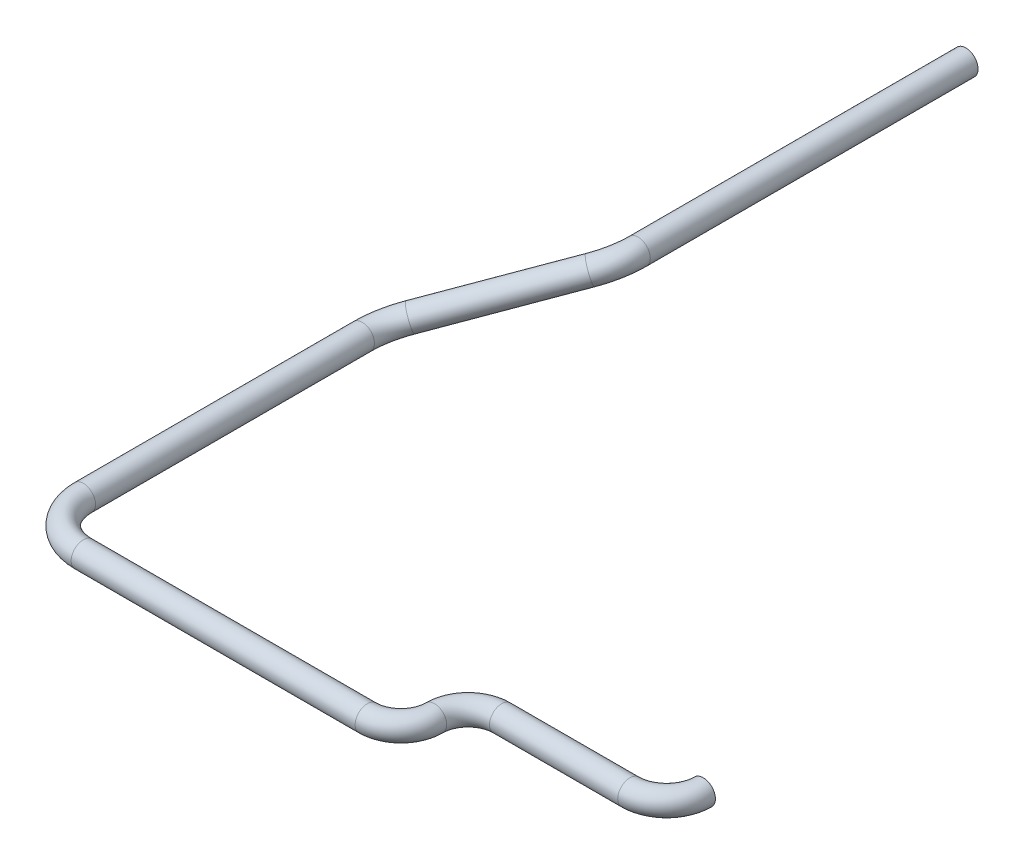
ISO-10303-21;
HEADER;
FILE_DESCRIPTION(('STEP AP214'),'2;1');
FILE_NAME('part.step','',(''),(''),'','','');
FILE_SCHEMA(('AUTOMOTIVE_DESIGN { 1 0 10303 214 1 1 1 1 }'));
ENDSEC;
DATA;
#1=APPLICATION_CONTEXT('core data for automotive mechanical design processes');
#2=APPLICATION_PROTOCOL_DEFINITION('international standard','automotive_design',2000,#1);
#3=PRODUCT_CONTEXT('',#1,'mechanical');
#4=PRODUCT('Part','Part','',(#3));
#5=PRODUCT_RELATED_PRODUCT_CATEGORY('part','',(#4));
#6=PRODUCT_DEFINITION_FORMATION('','',#4);
#7=PRODUCT_DEFINITION_CONTEXT('part definition',#1,'design');
#8=PRODUCT_DEFINITION('design','',#6,#7);
#9=PRODUCT_DEFINITION_SHAPE('','',#8);
#10=(LENGTH_UNIT() NAMED_UNIT(*) SI_UNIT(.MILLI.,.METRE.));
#11=(NAMED_UNIT(*) PLANE_ANGLE_UNIT() SI_UNIT($,.RADIAN.));
#12=(NAMED_UNIT(*) SI_UNIT($,.STERADIAN.) SOLID_ANGLE_UNIT());
#13=UNCERTAINTY_MEASURE_WITH_UNIT(LENGTH_MEASURE(1.E-05),#10,'distance_accuracy_value','');
#14=(GEOMETRIC_REPRESENTATION_CONTEXT(3) GLOBAL_UNCERTAINTY_ASSIGNED_CONTEXT((#13)) GLOBAL_UNIT_ASSIGNED_CONTEXT((#10,
#11,#12)) REPRESENTATION_CONTEXT('',''));
#15=CARTESIAN_POINT('',(0.,0.,0.));
#16=DIRECTION('',(0.,0.,1.));
#17=DIRECTION('',(1.,0.,0.));
#18=AXIS2_PLACEMENT_3D('',#15,#16,#17);
#19=CARTESIAN_POINT('',(-83.,8.,-33.));
#20=DIRECTION('',(0.,0.,-1.));
#21=DIRECTION('',(0.,-1.,0.));
#22=AXIS2_PLACEMENT_3D('',#19,#20,#21);
#23=PLANE('',#22);
#24=CARTESIAN_POINT('',(-83.,8.,-33.));
#25=DIRECTION('',(0.,0.,-1.));
#26=DIRECTION('',(-1.,0.,0.));
#27=AXIS2_PLACEMENT_3D('',#24,#25,#26);
#28=CIRCLE('',#27,2.);
#29=CARTESIAN_POINT('',(-85.,8.,-33.));
#30=VERTEX_POINT('',#29);
#31=EDGE_CURVE('E10',#30,#30,#28,.T.);
#32=ORIENTED_EDGE('',*,*,#31,.T.);
#33=EDGE_LOOP('',(#32));
#34=FACE_BOUND('',#33,.T.);
#35=ADVANCED_FACE('F15',(#34),#23,.T.);
#36=CARTESIAN_POINT('',(-9.,0.,84.));
#37=DIRECTION('',(0.,0.,1.));
#38=DIRECTION('',(1.,0.,0.));
#39=AXIS2_PLACEMENT_3D('',#36,#37,#38);
#40=PLANE('',#39);
#41=CARTESIAN_POINT('',(-9.,0.,84.));
#42=DIRECTION('',(0.,0.,1.));
#43=DIRECTION('',(1.,0.,0.));
#44=AXIS2_PLACEMENT_3D('',#41,#42,#43);
#45=CIRCLE('',#44,2.);
#46=CARTESIAN_POINT('',(-7.,0.,84.));
#47=VERTEX_POINT('',#46);
#48=EDGE_CURVE('E71',#47,#47,#45,.T.);
#49=ORIENTED_EDGE('',*,*,#48,.F.);
#50=EDGE_LOOP('',(#49));
#51=FACE_BOUND('',#50,.T.);
#52=ADVANCED_FACE('F92',(#51),#40,.F.);
#53=CARTESIAN_POINT('',(-83.,8.,20.668112782865));
#54=DIRECTION('',(0.,0.,-1.));
#55=DIRECTION('',(-1.,0.,0.));
#56=AXIS2_PLACEMENT_3D('',#53,#54,#55);
#57=CYLINDRICAL_SURFACE('',#56,2.);
#58=ORIENTED_EDGE('',*,*,#31,.F.);
#59=EDGE_LOOP('',(#58));
#60=FACE_BOUND('',#59,.T.);
#61=CARTESIAN_POINT('',(-83.,8.,20.668112782865));
#62=DIRECTION('',(0.,0.,1.));
#63=DIRECTION('',(0.91785703596029,0.396911150685126,0.));
#64=AXIS2_PLACEMENT_3D('',#61,#62,#63);
#65=CIRCLE('',#64,2.);
#66=CARTESIAN_POINT('',(-81.1642859280789,8.79382230137147,20.668112782865));
#67=VERTEX_POINT('',#66);
#68=EDGE_CURVE('E22',#67,#67,#65,.T.);
#69=ORIENTED_EDGE('',*,*,#68,.F.);
#70=EDGE_LOOP('',(#69));
#71=FACE_BOUND('',#70,.T.);
#72=ADVANCED_FACE('F94',(#60,#71),#57,.T.);
#73=CARTESIAN_POINT('',(-90.34285628768,4.824710794516,20.668112782865));
#74=DIRECTION('',(-0.396911150684989,0.917857035960349,1.47937218031302E-13));
#75=DIRECTION('',(0.646502447350988,0.279568625880995,0.709842214151987));
#76=AXIS2_PLACEMENT_3D('',#73,#74,#75);
#77=TOROIDAL_SURFACE('',#76,8.,2.);
#78=CARTESIAN_POINT('',(-85.17083670887,7.061259801568,26.346850496081));
#79=DIRECTION('',(0.651533670680954,0.28174429002415,-0.704360725060526));
#80=DIRECTION('',(-0.750935281604855,0.107703662008979,-0.651533670680874));
#81=AXIS2_PLACEMENT_3D('',#78,#79,#80);
#82=CIRCLE('',#81,2.);
#83=CARTESIAN_POINT('',(-83.8778318141696,7.62039705333011,27.7665349243827));
#84=VERTEX_POINT('',#83);
#85=EDGE_CURVE('E30',#84,#84,#82,.T.);
#86=CARTESIAN_POINT('',(-90.34285628768,4.824710794516,20.668112782865));
#87=DIRECTION('',(-0.396911150684989,0.917857035960349,1.47937218031302E-13));
#88=DIRECTION('',(0.646502447350988,0.279568625880995,0.709842214151987));
#89=AXIS2_PLACEMENT_3D('',#86,#87,#88);
#90=CIRCLE('',#89,10.);
#91=EDGE_CURVE('',#84,#67,#90,.T.);
#92=ORIENTED_EDGE('',*,*,#85,.T.);
#93=ORIENTED_EDGE('',*,*,#68,.T.);
#94=ORIENTED_EDGE('',*,*,#91,.T.);
#95=ORIENTED_EDGE('',*,*,#91,.F.);
#96=EDGE_LOOP('',(#92,#94,#93,#95));
#97=FACE_BOUND('',#96,.T.);
#98=ADVANCED_FACE('F101',(#97),#77,.T.);
#99=CARTESIAN_POINT('',(-99.32916329112,0.938740198432,41.653149503919));
#100=DIRECTION('',(0.651533670680954,0.28174429002415,-0.704360725060526));
#101=DIRECTION('',(-0.750935281604855,0.107703662008979,-0.651533670680874));
#102=AXIS2_PLACEMENT_3D('',#99,#100,#101);
#103=CYLINDRICAL_SURFACE('',#102,2.);
#104=ORIENTED_EDGE('',*,*,#85,.F.);
#105=EDGE_LOOP('',(#104));
#106=FACE_BOUND('',#105,.T.);
#107=CARTESIAN_POINT('',(-99.32916329112,0.938740198432,41.653149503919));
#108=DIRECTION('',(-0.651533670681006,-0.281744290024003,0.704360725060537));
#109=DIRECTION('',(-0.646502447350988,-0.279568625880995,-0.709842214151987));
#110=AXIS2_PLACEMENT_3D('',#107,#108,#109);
#111=CIRCLE('',#110,2.);
#112=CARTESIAN_POINT('',(-100.62216818582,0.379602946669895,40.2334650756173));
#113=VERTEX_POINT('',#112);
#114=EDGE_CURVE('E36',#113,#113,#111,.T.);
#115=ORIENTED_EDGE('',*,*,#114,.F.);
#116=EDGE_LOOP('',(#115));
#117=FACE_BOUND('',#116,.T.);
#118=ADVANCED_FACE('F107',(#106,#117),#103,.T.);
#119=CARTESIAN_POINT('',(-94.15714371231,3.175289205484,47.331887217135));
#120=DIRECTION('',(0.396911150685126,-0.91785703596029,0.));
#121=DIRECTION('',(-0.91785703596029,-0.396911150685126,0.));
#122=AXIS2_PLACEMENT_3D('',#119,#120,#121);
#123=TOROIDAL_SURFACE('',#122,8.,2.);
#124=CARTESIAN_POINT('',(-101.5,0.,47.331887217135));
#125=DIRECTION('',(0.,0.,-1.));
#126=DIRECTION('',(-1.,0.,0.));
#127=AXIS2_PLACEMENT_3D('',#124,#125,#126);
#128=CIRCLE('',#127,2.);
#129=CARTESIAN_POINT('',(-103.335714071913,-0.793822301366911,47.331887217135));
#130=VERTEX_POINT('',#129);
#131=EDGE_CURVE('E43',#130,#130,#128,.T.);
#132=CARTESIAN_POINT('',(-94.15714371231,3.175289205484,47.331887217135));
#133=DIRECTION('',(0.396911150685126,-0.91785703596029,0.));
#134=DIRECTION('',(-0.91785703596029,-0.396911150685126,0.));
#135=AXIS2_PLACEMENT_3D('',#132,#133,#134);
#136=CIRCLE('',#135,10.);
#137=EDGE_CURVE('',#130,#113,#136,.T.);
#138=ORIENTED_EDGE('',*,*,#131,.T.);
#139=ORIENTED_EDGE('',*,*,#114,.T.);
#140=ORIENTED_EDGE('',*,*,#137,.T.);
#141=ORIENTED_EDGE('',*,*,#137,.F.);
#142=EDGE_LOOP('',(#138,#140,#139,#141));
#143=FACE_BOUND('',#142,.T.);
#144=ADVANCED_FACE('F110',(#143),#123,.T.);
#145=CARTESIAN_POINT('',(-101.5,0.,93.));
#146=DIRECTION('',(0.,0.,-1.));
#147=DIRECTION('',(-1.,0.,0.));
#148=AXIS2_PLACEMENT_3D('',#145,#146,#147);
#149=CYLINDRICAL_SURFACE('',#148,2.);
#150=ORIENTED_EDGE('',*,*,#131,.F.);
#151=EDGE_LOOP('',(#150));
#152=FACE_BOUND('',#151,.T.);
#153=CARTESIAN_POINT('',(-101.5,0.,93.));
#154=DIRECTION('',(0.,0.,1.));
#155=DIRECTION('',(-1.,0.,0.));
#156=AXIS2_PLACEMENT_3D('',#153,#154,#155);
#157=CIRCLE('',#156,2.);
#158=CARTESIAN_POINT('',(-103.5,0.,93.));
#159=VERTEX_POINT('',#158);
#160=EDGE_CURVE('E39',#159,#159,#157,.T.);
#161=ORIENTED_EDGE('',*,*,#160,.F.);
#162=EDGE_LOOP('',(#161));
#163=FACE_BOUND('',#162,.T.);
#164=ADVANCED_FACE('F114',(#152,#163),#149,.T.);
#165=CARTESIAN_POINT('',(-93.5,0.,93.));
#166=DIRECTION('',(0.,-1.,0.));
#167=DIRECTION('',(0.,0.,1.));
#168=AXIS2_PLACEMENT_3D('',#165,#166,#167);
#169=TOROIDAL_SURFACE('',#168,8.,2.);
#170=CARTESIAN_POINT('',(-93.5,0.,101.));
#171=DIRECTION('',(-1.,0.,0.));
#172=DIRECTION('',(0.,0.,1.));
#173=AXIS2_PLACEMENT_3D('',#170,#171,#172);
#174=CIRCLE('',#173,2.);
#175=CARTESIAN_POINT('',(-93.5,0.,103.));
#176=VERTEX_POINT('',#175);
#177=EDGE_CURVE('E44',#176,#176,#174,.T.);
#178=CARTESIAN_POINT('',(-93.5,0.,93.));
#179=DIRECTION('',(0.,-1.,0.));
#180=DIRECTION('',(0.,0.,1.));
#181=AXIS2_PLACEMENT_3D('',#178,#179,#180);
#182=CIRCLE('',#181,10.);
#183=EDGE_CURVE('',#176,#159,#182,.T.);
#184=ORIENTED_EDGE('',*,*,#177,.T.);
#185=ORIENTED_EDGE('',*,*,#160,.T.);
#186=ORIENTED_EDGE('',*,*,#183,.T.);
#187=ORIENTED_EDGE('',*,*,#183,.F.);
#188=EDGE_LOOP('',(#184,#186,#185,#187));
#189=FACE_BOUND('',#188,.T.);
#190=ADVANCED_FACE('F118',(#189),#169,.T.);
#191=CARTESIAN_POINT('',(-46.999,0.,101.));
#192=DIRECTION('',(-1.,0.,0.));
#193=DIRECTION('',(0.,0.,1.));
#194=AXIS2_PLACEMENT_3D('',#191,#192,#193);
#195=CYLINDRICAL_SURFACE('',#194,2.);
#196=ORIENTED_EDGE('',*,*,#177,.F.);
#197=EDGE_LOOP('',(#196));
#198=FACE_BOUND('',#197,.T.);
#199=CARTESIAN_POINT('',(-46.999,0.,101.));
#200=DIRECTION('',(1.,0.,0.));
#201=DIRECTION('',(0.,0.,1.));
#202=AXIS2_PLACEMENT_3D('',#199,#200,#201);
#203=CIRCLE('',#202,2.);
#204=CARTESIAN_POINT('',(-46.999,0.,103.));
#205=VERTEX_POINT('',#204);
#206=EDGE_CURVE('E45',#205,#205,#203,.T.);
#207=ORIENTED_EDGE('',*,*,#206,.F.);
#208=EDGE_LOOP('',(#207));
#209=FACE_BOUND('',#208,.T.);
#210=ADVANCED_FACE('F122',(#198,#209),#195,.T.);
#211=CARTESIAN_POINT('',(-46.999,0.,95.501));
#212=DIRECTION('',(0.,-1.,0.));
#213=DIRECTION('',(1.,0.,0.));
#214=AXIS2_PLACEMENT_3D('',#211,#212,#213);
#215=TOROIDAL_SURFACE('',#214,5.499,2.);
#216=CARTESIAN_POINT('',(-41.5,0.,95.501));
#217=DIRECTION('',(0.,0.,1.));
#218=DIRECTION('',(1.,0.,0.));
#219=AXIS2_PLACEMENT_3D('',#216,#217,#218);
#220=CIRCLE('',#219,2.);
#221=CARTESIAN_POINT('',(-39.5,0.,95.501));
#222=VERTEX_POINT('',#221);
#223=EDGE_CURVE('E49',#222,#222,#220,.T.);
#224=CARTESIAN_POINT('',(-46.999,0.,95.501));
#225=DIRECTION('',(0.,-1.,0.));
#226=DIRECTION('',(1.,0.,0.));
#227=AXIS2_PLACEMENT_3D('',#224,#225,#226);
#228=CIRCLE('',#227,7.499);
#229=EDGE_CURVE('',#222,#205,#228,.T.);
#230=ORIENTED_EDGE('',*,*,#223,.T.);
#231=ORIENTED_EDGE('',*,*,#206,.T.);
#232=ORIENTED_EDGE('',*,*,#229,.T.);
#233=ORIENTED_EDGE('',*,*,#229,.F.);
#234=EDGE_LOOP('',(#230,#232,#231,#233));
#235=FACE_BOUND('',#234,.T.);
#236=ADVANCED_FACE('F126',(#235),#215,.T.);
#237=CARTESIAN_POINT('',(-41.5,0.,95.499));
#238=DIRECTION('',(0.,0.,1.));
#239=DIRECTION('',(1.,0.,0.));
#240=AXIS2_PLACEMENT_3D('',#237,#238,#239);
#241=CYLINDRICAL_SURFACE('',#240,2.);
#242=ORIENTED_EDGE('',*,*,#223,.F.);
#243=EDGE_LOOP('',(#242));
#244=FACE_BOUND('',#243,.T.);
#245=CARTESIAN_POINT('',(-41.5,0.,95.499));
#246=DIRECTION('',(0.,0.,-1.));
#247=DIRECTION('',(-1.,0.,0.));
#248=AXIS2_PLACEMENT_3D('',#245,#246,#247);
#249=CIRCLE('',#248,2.);
#250=CARTESIAN_POINT('',(-43.5,0.,95.499));
#251=VERTEX_POINT('',#250);
#252=EDGE_CURVE('E53',#251,#251,#249,.T.);
#253=ORIENTED_EDGE('',*,*,#252,.F.);
#254=EDGE_LOOP('',(#253));
#255=FACE_BOUND('',#254,.T.);
#256=ADVANCED_FACE('F130',(#244,#255),#241,.T.);
#257=CARTESIAN_POINT('',(-36.001,0.,95.499));
#258=DIRECTION('',(0.,1.,0.));
#259=DIRECTION('',(0.,0.,-1.));
#260=AXIS2_PLACEMENT_3D('',#257,#258,#259);
#261=TOROIDAL_SURFACE('',#260,5.499,2.);
#262=CARTESIAN_POINT('',(-36.001,0.,90.));
#263=DIRECTION('',(-1.,0.,0.));
#264=DIRECTION('',(0.,0.,1.));
#265=AXIS2_PLACEMENT_3D('',#262,#263,#264);
#266=CIRCLE('',#265,2.);
#267=CARTESIAN_POINT('',(-36.001,0.,88.));
#268=VERTEX_POINT('',#267);
#269=EDGE_CURVE('E60',#268,#268,#266,.T.);
#270=CARTESIAN_POINT('',(-36.001,0.,95.499));
#271=DIRECTION('',(0.,1.,0.));
#272=DIRECTION('',(0.,0.,-1.));
#273=AXIS2_PLACEMENT_3D('',#270,#271,#272);
#274=CIRCLE('',#273,7.499);
#275=EDGE_CURVE('',#268,#251,#274,.T.);
#276=ORIENTED_EDGE('',*,*,#269,.T.);
#277=ORIENTED_EDGE('',*,*,#252,.T.);
#278=ORIENTED_EDGE('',*,*,#275,.T.);
#279=ORIENTED_EDGE('',*,*,#275,.F.);
#280=EDGE_LOOP('',(#276,#278,#277,#279));
#281=FACE_BOUND('',#280,.T.);
#282=ADVANCED_FACE('F135',(#281),#261,.T.);
#283=CARTESIAN_POINT('',(-14.999,0.,90.));
#284=DIRECTION('',(-1.,0.,0.));
#285=DIRECTION('',(0.,0.,1.));
#286=AXIS2_PLACEMENT_3D('',#283,#284,#285);
#287=CYLINDRICAL_SURFACE('',#286,2.);
#288=ORIENTED_EDGE('',*,*,#269,.F.);
#289=EDGE_LOOP('',(#288));
#290=FACE_BOUND('',#289,.T.);
#291=CARTESIAN_POINT('',(-14.999,0.,90.));
#292=DIRECTION('',(1.,0.,0.));
#293=DIRECTION('',(0.,0.,1.));
#294=AXIS2_PLACEMENT_3D('',#291,#292,#293);
#295=CIRCLE('',#294,2.);
#296=CARTESIAN_POINT('',(-14.999,0.,92.));
#297=VERTEX_POINT('',#296);
#298=EDGE_CURVE('E64',#297,#297,#295,.T.);
#299=ORIENTED_EDGE('',*,*,#298,.F.);
#300=EDGE_LOOP('',(#299));
#301=FACE_BOUND('',#300,.T.);
#302=ADVANCED_FACE('F132',(#290,#301),#287,.T.);
#303=CARTESIAN_POINT('',(-14.999,0.,84.001));
#304=DIRECTION('',(0.,-1.,0.));
#305=DIRECTION('',(1.,0.,0.));
#306=AXIS2_PLACEMENT_3D('',#303,#304,#305);
#307=TOROIDAL_SURFACE('',#306,5.999,2.);
#308=CARTESIAN_POINT('',(-9.,0.,84.001));
#309=DIRECTION('',(0.,0.,1.));
#310=DIRECTION('',(1.,0.,0.));
#311=AXIS2_PLACEMENT_3D('',#308,#309,#310);
#312=CIRCLE('',#311,2.);
#313=CARTESIAN_POINT('',(-7.,0.,84.001));
#314=VERTEX_POINT('',#313);
#315=EDGE_CURVE('E78',#314,#314,#312,.T.);
#316=CARTESIAN_POINT('',(-14.999,0.,84.001));
#317=DIRECTION('',(0.,-1.,0.));
#318=DIRECTION('',(1.,0.,0.));
#319=AXIS2_PLACEMENT_3D('',#316,#317,#318);
#320=CIRCLE('',#319,7.999);
#321=EDGE_CURVE('',#314,#297,#320,.T.);
#322=ORIENTED_EDGE('',*,*,#315,.T.);
#323=ORIENTED_EDGE('',*,*,#298,.T.);
#324=ORIENTED_EDGE('',*,*,#321,.T.);
#325=ORIENTED_EDGE('',*,*,#321,.F.);
#326=EDGE_LOOP('',(#322,#324,#323,#325));
#327=FACE_BOUND('',#326,.T.);
#328=ADVANCED_FACE('F84',(#327),#307,.T.);
#329=CARTESIAN_POINT('',(-9.,0.,84.));
#330=DIRECTION('',(0.,0.,1.));
#331=DIRECTION('',(1.,0.,0.));
#332=AXIS2_PLACEMENT_3D('',#329,#330,#331);
#333=CYLINDRICAL_SURFACE('',#332,2.);
#334=ORIENTED_EDGE('',*,*,#315,.F.);
#335=EDGE_LOOP('',(#334));
#336=FACE_BOUND('',#335,.T.);
#337=ORIENTED_EDGE('',*,*,#48,.T.);
#338=EDGE_LOOP('',(#337));
#339=FACE_BOUND('',#338,.T.);
#340=ADVANCED_FACE('F86',(#336,#339),#333,.T.);
#341=CLOSED_SHELL('',(#35,#52,#72,#98,#118,#144,#164,#190,#210,#236,#256,#282,#302,#328,#340));
#342=MANIFOLD_SOLID_BREP('B1',#341);
#343=ADVANCED_BREP_SHAPE_REPRESENTATION('',(#18,#342),#14);
#344=SHAPE_DEFINITION_REPRESENTATION(#9,#343);
ENDSEC;
END-ISO-10303-21;
